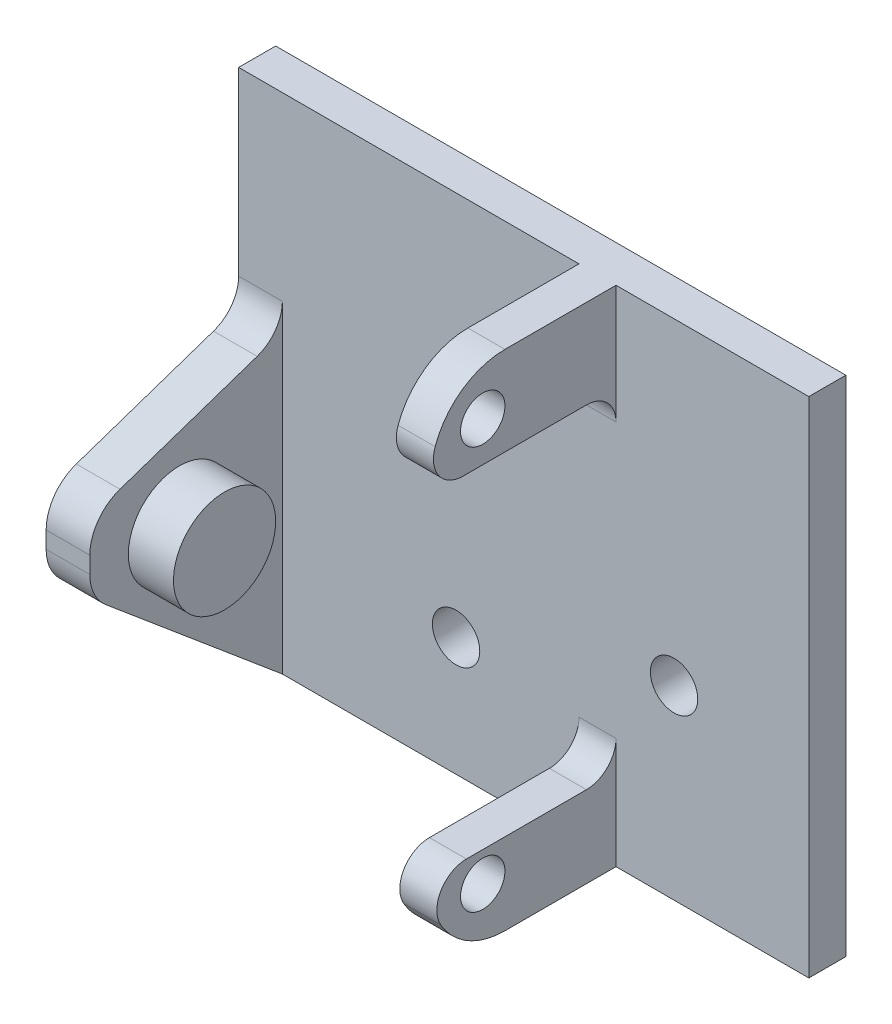
ISO-10303-21;
HEADER;
FILE_DESCRIPTION(('STEP AP214'),'2;1');
FILE_NAME('part.step','',(''),(''),'','','');
FILE_SCHEMA(('AUTOMOTIVE_DESIGN { 1 0 10303 214 1 1 1 1 }'));
ENDSEC;
DATA;
#1=APPLICATION_CONTEXT('core data for automotive mechanical design processes');
#2=APPLICATION_PROTOCOL_DEFINITION('international standard','automotive_design',2000,#1);
#3=PRODUCT_CONTEXT('',#1,'mechanical');
#4=PRODUCT('Part','Part','',(#3));
#5=PRODUCT_RELATED_PRODUCT_CATEGORY('part','',(#4));
#6=PRODUCT_DEFINITION_FORMATION('','',#4);
#7=PRODUCT_DEFINITION_CONTEXT('part definition',#1,'design');
#8=PRODUCT_DEFINITION('design','',#6,#7);
#9=PRODUCT_DEFINITION_SHAPE('','',#8);
#10=(LENGTH_UNIT() NAMED_UNIT(*) SI_UNIT(.MILLI.,.METRE.));
#11=(NAMED_UNIT(*) PLANE_ANGLE_UNIT() SI_UNIT($,.RADIAN.));
#12=(NAMED_UNIT(*) SI_UNIT($,.STERADIAN.) SOLID_ANGLE_UNIT());
#13=UNCERTAINTY_MEASURE_WITH_UNIT(LENGTH_MEASURE(1.E-05),#10,'distance_accuracy_value','');
#14=(GEOMETRIC_REPRESENTATION_CONTEXT(3) GLOBAL_UNCERTAINTY_ASSIGNED_CONTEXT((#13)) GLOBAL_UNIT_ASSIGNED_CONTEXT((#10,
#11,#12)) REPRESENTATION_CONTEXT('',''));
#15=CARTESIAN_POINT('',(0.,0.,0.));
#16=DIRECTION('',(0.,0.,1.));
#17=DIRECTION('',(1.,0.,0.));
#18=AXIS2_PLACEMENT_3D('',#15,#16,#17);
#19=CARTESIAN_POINT('',(-22.6450142317514,6.71013779527559,2.5));
#20=DIRECTION('',(1.,0.,0.));
#21=DIRECTION('',(0.,1.,0.));
#22=AXIS2_PLACEMENT_3D('',#19,#20,#21);
#23=PLANE('',#22);
#24=DIRECTION('',(0.,0.64331211729061,0.765604022812755));
#25=VECTOR('',#24,1.);
#26=CARTESIAN_POINT('',(-22.6450142317514,-17.2272454875677,14.4754931262982));
#27=LINE('',#26,#25);
#28=CARTESIAN_POINT('',(-22.6450142317514,-27.2898622047244,2.49999999999998));
#29=VERTEX_POINT('',#28);
#30=CARTESIAN_POINT('',(-22.6450142317514,-17.2655253608963,14.4299363518718));
#31=VERTEX_POINT('',#30);
#32=EDGE_CURVE('E209',#29,#31,#27,.T.);
#33=ORIENTED_EDGE('',*,*,#32,.T.);
#34=CARTESIAN_POINT('',(-22.6450142317514,-14.9687132924581,12.5));
#35=DIRECTION('',(1.,0.,0.));
#36=DIRECTION('',(0.,1.,0.));
#37=AXIS2_PLACEMENT_3D('',#34,#35,#36);
#38=CIRCLE('',#37,3.);
#39=CARTESIAN_POINT('',(-22.6450142317514,-14.9687132924581,15.5));
#40=VERTEX_POINT('',#39);
#41=EDGE_CURVE('E257',#31,#40,#38,.F.);
#42=ORIENTED_EDGE('',*,*,#41,.T.);
#43=DIRECTION('',(0.,-1.,0.));
#44=VECTOR('',#43,1.);
#45=CARTESIAN_POINT('',(-22.6450142317514,-7.28986220472441,15.5));
#46=LINE('',#45,#44);
#47=CARTESIAN_POINT('',(-22.6450142317514,-13.84136194244,15.5));
#48=VERTEX_POINT('',#47);
#49=EDGE_CURVE('E486',#48,#40,#46,.T.);
#50=ORIENTED_EDGE('',*,*,#49,.F.);
#51=CARTESIAN_POINT('',(-22.6450142317514,-13.84136194244,12.5));
#52=DIRECTION('',(1.,0.,0.));
#53=DIRECTION('',(0.,1.,0.));
#54=AXIS2_PLACEMENT_3D('',#51,#52,#53);
#55=CIRCLE('',#54,3.);
#56=CARTESIAN_POINT('',(-22.6450142317514,-10.9996910491199,13.4617206112261));
#57=VERTEX_POINT('',#56);
#58=EDGE_CURVE('E255',#48,#57,#55,.F.);
#59=ORIENTED_EDGE('',*,*,#58,.T.);
#60=DIRECTION('',(0.,0.320573537075366,-0.947223631106714));
#61=VECTOR('',#60,1.);
#62=CARTESIAN_POINT('',(-22.6450142317514,-5.78156499843623,-1.95668338554259));
#63=LINE('',#62,#61);
#64=CARTESIAN_POINT('',(-22.6450142317514,-7.86471627626999,4.19856615731159));
#65=VERTEX_POINT('',#64);
#66=EDGE_CURVE('E231',#57,#65,#63,.T.);
#67=ORIENTED_EDGE('',*,*,#66,.T.);
#68=CARTESIAN_POINT('',(-22.6450142317514,-5.49665719850321,5.));
#69=DIRECTION('',(1.,0.,0.));
#70=DIRECTION('',(0.,1.,0.));
#71=AXIS2_PLACEMENT_3D('',#68,#69,#70);
#72=CIRCLE('',#71,2.5);
#73=CARTESIAN_POINT('',(-22.6450142317514,-5.49665719850321,2.5));
#74=VERTEX_POINT('',#73);
#75=EDGE_CURVE('E267',#65,#74,#72,.T.);
#76=ORIENTED_EDGE('',*,*,#75,.T.);
#77=DIRECTION('',(0.,-1.,0.));
#78=VECTOR('',#77,1.);
#79=CARTESIAN_POINT('',(-22.6450142317514,6.71013779527559,2.5));
#80=LINE('',#79,#78);
#81=CARTESIAN_POINT('',(-22.6450142317514,6.71013779527559,2.5));
#82=VERTEX_POINT('',#81);
#83=EDGE_CURVE('E344',#82,#74,#80,.T.);
#84=ORIENTED_EDGE('',*,*,#83,.F.);
#85=DIRECTION('',(0.,0.,-1.));
#86=VECTOR('',#85,1.);
#87=CARTESIAN_POINT('',(-22.6450142317514,6.71013779527559,2.5));
#88=LINE('',#87,#86);
#89=CARTESIAN_POINT('',(-22.6450142317514,6.71013779527559,0.));
#90=VERTEX_POINT('',#89);
#91=EDGE_CURVE('E356',#82,#90,#88,.T.);
#92=ORIENTED_EDGE('',*,*,#91,.T.);
#93=DIRECTION('',(0.,-1.,0.));
#94=VECTOR('',#93,1.);
#95=CARTESIAN_POINT('',(-22.6450142317514,6.71013779527559,0.));
#96=LINE('',#95,#94);
#97=CARTESIAN_POINT('',(-22.6450142317514,-27.2898622047244,0.));
#98=VERTEX_POINT('',#97);
#99=EDGE_CURVE('E236',#90,#98,#96,.T.);
#100=ORIENTED_EDGE('',*,*,#99,.T.);
#101=DIRECTION('',(0.,0.,-1.));
#102=VECTOR('',#101,1.);
#103=CARTESIAN_POINT('',(-22.6450142317514,-27.2898622047244,2.5));
#104=LINE('',#103,#102);
#105=EDGE_CURVE('E226',#29,#98,#104,.T.);
#106=ORIENTED_EDGE('',*,*,#105,.F.);
#107=EDGE_LOOP('',(#33,#42,#50,#59,#67,#76,#84,#92,#100,#106));
#108=FACE_BOUND('',#107,.T.);
#109=ADVANCED_FACE('F60',(#108),#23,.F.);
#110=CARTESIAN_POINT('',(-22.6450142317514,-27.2898622047244,2.5));
#111=DIRECTION('',(0.,1.,0.));
#112=DIRECTION('',(0.,0.,1.));
#113=AXIS2_PLACEMENT_3D('',#110,#111,#112);
#114=PLANE('',#113);
#115=DIRECTION('',(0.,0.,-1.));
#116=VECTOR('',#115,1.);
#117=CARTESIAN_POINT('',(2.83498576824857,-27.2898622047244,15.));
#118=LINE('',#117,#116);
#119=CARTESIAN_POINT('',(2.83498576824857,-27.2898622047244,10.));
#120=VERTEX_POINT('',#119);
#121=CARTESIAN_POINT('',(2.83498576824857,-27.2898622047244,2.5));
#122=VERTEX_POINT('',#121);
#123=EDGE_CURVE('E342',#120,#122,#118,.T.);
#124=ORIENTED_EDGE('',*,*,#123,.F.);
#125=DIRECTION('',(1.,0.,0.));
#126=VECTOR('',#125,1.);
#127=CARTESIAN_POINT('',(-22.6450142317514,-27.2898622047244,10.));
#128=LINE('',#127,#126);
#129=CARTESIAN_POINT('',(0.334985768248565,-27.2898622047244,10.));
#130=VERTEX_POINT('',#129);
#131=EDGE_CURVE('E297',#120,#130,#128,.F.);
#132=ORIENTED_EDGE('',*,*,#131,.T.);
#133=DIRECTION('',(0.,0.,-1.));
#134=VECTOR('',#133,1.);
#135=CARTESIAN_POINT('',(0.334985768248565,-27.2898622047244,15.));
#136=LINE('',#135,#134);
#137=CARTESIAN_POINT('',(0.334985768248565,-27.2898622047244,2.5));
#138=VERTEX_POINT('',#137);
#139=EDGE_CURVE('E331',#130,#138,#136,.T.);
#140=ORIENTED_EDGE('',*,*,#139,.T.);
#141=DIRECTION('',(1.,0.,0.));
#142=VECTOR('',#141,1.);
#143=CARTESIAN_POINT('',(-22.6450142317514,-27.2898622047244,2.5));
#144=LINE('',#143,#142);
#145=CARTESIAN_POINT('',(-19.6950142317514,-27.2898622047244,2.49999999999998));
#146=VERTEX_POINT('',#145);
#147=EDGE_CURVE('E229',#146,#138,#144,.T.);
#148=ORIENTED_EDGE('',*,*,#147,.F.);
#149=DIRECTION('',(-1.,0.,0.));
#150=VECTOR('',#149,1.);
#151=CARTESIAN_POINT('',(-7.64501423175144,-27.2898622047244,2.49999999999998));
#152=LINE('',#151,#150);
#153=EDGE_CURVE('E213',#146,#29,#152,.T.);
#154=ORIENTED_EDGE('',*,*,#153,.T.);
#155=ORIENTED_EDGE('',*,*,#105,.T.);
#156=DIRECTION('',(1.,0.,0.));
#157=VECTOR('',#156,1.);
#158=CARTESIAN_POINT('',(-22.6450142317514,-27.2898622047244,0.));
#159=LINE('',#158,#157);
#160=CARTESIAN_POINT('',(15.8549857682486,-27.2898622047244,0.));
#161=VERTEX_POINT('',#160);
#162=EDGE_CURVE('E358',#98,#161,#159,.T.);
#163=ORIENTED_EDGE('',*,*,#162,.T.);
#164=DIRECTION('',(0.,0.,-1.));
#165=VECTOR('',#164,1.);
#166=CARTESIAN_POINT('',(15.8549857682486,-27.2898622047244,2.5));
#167=LINE('',#166,#165);
#168=CARTESIAN_POINT('',(15.8549857682486,-27.2898622047244,2.5));
#169=VERTEX_POINT('',#168);
#170=EDGE_CURVE('E238',#169,#161,#167,.T.);
#171=ORIENTED_EDGE('',*,*,#170,.F.);
#172=EDGE_CURVE('E347',#122,#169,#144,.T.);
#173=ORIENTED_EDGE('',*,*,#172,.F.);
#174=EDGE_LOOP('',(#124,#132,#140,#148,#154,#155,#163,#171,#173));
#175=FACE_BOUND('',#174,.T.);
#176=ADVANCED_FACE('F225',(#175),#114,.F.);
#177=CARTESIAN_POINT('',(-19.6950142317514,-27.2898622047244,15.5));
#178=DIRECTION('',(-1.,0.,0.));
#179=DIRECTION('',(0.,0.,1.));
#180=AXIS2_PLACEMENT_3D('',#177,#178,#179);
#181=PLANE('',#180);
#182=CARTESIAN_POINT('',(-19.6950142317514,-15.0898622047244,9.45));
#183=DIRECTION('',(-1.,0.,0.));
#184=DIRECTION('',(0.,0.,1.));
#185=AXIS2_PLACEMENT_3D('',#182,#183,#184);
#186=CIRCLE('',#185,3.45);
#187=CARTESIAN_POINT('',(-19.6950142317514,-15.0898622047244,12.9));
#188=VERTEX_POINT('',#187);
#189=EDGE_CURVE('E220',#188,#188,#186,.T.);
#190=ORIENTED_EDGE('',*,*,#189,.T.);
#191=EDGE_LOOP('',(#190));
#192=FACE_BOUND('',#191,.T.);
#193=DIRECTION('',(0.,1.,0.));
#194=VECTOR('',#193,1.);
#195=CARTESIAN_POINT('',(-19.6950142317514,-27.2898622047244,15.5));
#196=LINE('',#195,#194);
#197=CARTESIAN_POINT('',(-19.6950142317514,-14.9687132924581,15.5));
#198=VERTEX_POINT('',#197);
#199=CARTESIAN_POINT('',(-19.6950142317514,-13.84136194244,15.5));
#200=VERTEX_POINT('',#199);
#201=EDGE_CURVE('E483',#198,#200,#196,.T.);
#202=ORIENTED_EDGE('',*,*,#201,.F.);
#203=CARTESIAN_POINT('',(-19.6950142317514,-14.9687132924581,12.5));
#204=DIRECTION('',(-1.,0.,0.));
#205=DIRECTION('',(0.,0.,1.));
#206=AXIS2_PLACEMENT_3D('',#203,#204,#205);
#207=CIRCLE('',#206,3.);
#208=CARTESIAN_POINT('',(-19.6950142317514,-17.2655253608963,14.4299363518718));
#209=VERTEX_POINT('',#208);
#210=EDGE_CURVE('E252',#198,#209,#207,.F.);
#211=ORIENTED_EDGE('',*,*,#210,.T.);
#212=DIRECTION('',(0.,0.64331211729061,0.765604022812755));
#213=VECTOR('',#212,1.);
#214=CARTESIAN_POINT('',(-19.6950142317514,-20.88707172074,10.1199437567119));
#215=LINE('',#214,#213);
#216=EDGE_CURVE('E478',#146,#209,#215,.T.);
#217=ORIENTED_EDGE('',*,*,#216,.F.);
#218=DIRECTION('',(0.,1.,0.));
#219=VECTOR('',#218,1.);
#220=CARTESIAN_POINT('',(-19.6950142317514,-27.2898622047244,2.5));
#221=LINE('',#220,#219);
#222=CARTESIAN_POINT('',(-19.6950142317514,-5.49665719850321,2.5));
#223=VERTEX_POINT('',#222);
#224=EDGE_CURVE('E473',#146,#223,#221,.T.);
#225=ORIENTED_EDGE('',*,*,#224,.T.);
#226=CARTESIAN_POINT('',(-19.6950142317514,-5.49665719850321,5.));
#227=DIRECTION('',(-1.,0.,0.));
#228=DIRECTION('',(0.,0.,1.));
#229=AXIS2_PLACEMENT_3D('',#226,#227,#228);
#230=CIRCLE('',#229,2.5);
#231=CARTESIAN_POINT('',(-19.6950142317514,-7.86471627626999,4.19856615731158));
#232=VERTEX_POINT('',#231);
#233=EDGE_CURVE('E269',#223,#232,#230,.T.);
#234=ORIENTED_EDGE('',*,*,#233,.T.);
#235=DIRECTION('',(0.,0.320573537075366,-0.947223631106715));
#236=VECTOR('',#235,1.);
#237=CARTESIAN_POINT('',(-19.6950142317514,-13.2927228459129,20.2371204917559));
#238=LINE('',#237,#236);
#239=CARTESIAN_POINT('',(-19.6950142317514,-10.9996910491199,13.4617206112261));
#240=VERTEX_POINT('',#239);
#241=EDGE_CURVE('E471',#240,#232,#238,.T.);
#242=ORIENTED_EDGE('',*,*,#241,.F.);
#243=CARTESIAN_POINT('',(-19.6950142317514,-13.84136194244,12.5));
#244=DIRECTION('',(-1.,0.,0.));
#245=DIRECTION('',(0.,0.,1.));
#246=AXIS2_PLACEMENT_3D('',#243,#244,#245);
#247=CIRCLE('',#246,3.);
#248=EDGE_CURVE('E250',#240,#200,#247,.F.);
#249=ORIENTED_EDGE('',*,*,#248,.T.);
#250=EDGE_LOOP('',(#202,#211,#217,#225,#234,#242,#249));
#251=FACE_BOUND('',#250,.T.);
#252=ADVANCED_FACE('F396',(#192,#251),#181,.F.);
#253=CARTESIAN_POINT('',(0.,0.,15.5));
#254=DIRECTION('',(0.,0.,1.));
#255=DIRECTION('',(1.,0.,0.));
#256=AXIS2_PLACEMENT_3D('',#253,#254,#255);
#257=PLANE('',#256);
#258=ORIENTED_EDGE('',*,*,#49,.T.);
#259=DIRECTION('',(1.,0.,0.));
#260=VECTOR('',#259,1.);
#261=CARTESIAN_POINT('',(0.,-14.9687132924581,15.5));
#262=LINE('',#261,#260);
#263=EDGE_CURVE('E241',#40,#198,#262,.T.);
#264=ORIENTED_EDGE('',*,*,#263,.T.);
#265=ORIENTED_EDGE('',*,*,#201,.T.);
#266=DIRECTION('',(-1.,0.,0.));
#267=VECTOR('',#266,1.);
#268=CARTESIAN_POINT('',(0.,-13.84136194244,15.5));
#269=LINE('',#268,#267);
#270=EDGE_CURVE('E237',#200,#48,#269,.T.);
#271=ORIENTED_EDGE('',*,*,#270,.T.);
#272=EDGE_LOOP('',(#258,#264,#265,#271));
#273=FACE_BOUND('',#272,.T.);
#274=ADVANCED_FACE('F522',(#273),#257,.T.);
#275=CARTESIAN_POINT('',(0.,0.,2.5));
#276=DIRECTION('',(0.,0.,1.));
#277=DIRECTION('',(1.,0.,0.));
#278=AXIS2_PLACEMENT_3D('',#275,#276,#277);
#279=PLANE('',#278);
#280=CARTESIAN_POINT('',(-7.96501423175144,-19.2898622047244,2.5));
#281=DIRECTION('',(0.,0.,1.));
#282=DIRECTION('',(1.,0.,0.));
#283=AXIS2_PLACEMENT_3D('',#280,#281,#282);
#284=CIRCLE('',#283,1.6);
#285=CARTESIAN_POINT('',(-6.36501423175144,-19.2898622047244,2.5));
#286=VERTEX_POINT('',#285);
#287=EDGE_CURVE('E752',#286,#286,#284,.T.);
#288=ORIENTED_EDGE('',*,*,#287,.F.);
#289=EDGE_LOOP('',(#288));
#290=FACE_BOUND('',#289,.T.);
#291=CARTESIAN_POINT('',(6.75498576824856,-14.7398622047244,2.5));
#292=DIRECTION('',(0.,0.,1.));
#293=DIRECTION('',(1.,0.,0.));
#294=AXIS2_PLACEMENT_3D('',#291,#292,#293);
#295=CIRCLE('',#294,1.6);
#296=CARTESIAN_POINT('',(8.35498576824856,-14.7398622047244,2.5));
#297=VERTEX_POINT('',#296);
#298=EDGE_CURVE('E757',#297,#297,#295,.T.);
#299=ORIENTED_EDGE('',*,*,#298,.F.);
#300=EDGE_LOOP('',(#299));
#301=FACE_BOUND('',#300,.T.);
#302=DIRECTION('',(0.,-1.,0.));
#303=VECTOR('',#302,1.);
#304=CARTESIAN_POINT('',(0.334985768248565,-27.2898622047244,2.5));
#305=LINE('',#304,#303);
#306=CARTESIAN_POINT('',(0.334985768248567,-19.7898622047244,2.5));
#307=VERTEX_POINT('',#306);
#308=EDGE_CURVE('E332',#307,#138,#305,.T.);
#309=ORIENTED_EDGE('',*,*,#308,.F.);
#310=DIRECTION('',(-1.,0.,0.));
#311=VECTOR('',#310,1.);
#312=CARTESIAN_POINT('',(0.,-19.7898622047244,2.5));
#313=LINE('',#312,#311);
#314=CARTESIAN_POINT('',(2.83498576824856,-19.7898622047244,2.5));
#315=VERTEX_POINT('',#314);
#316=EDGE_CURVE('E277',#307,#315,#313,.F.);
#317=ORIENTED_EDGE('',*,*,#316,.T.);
#318=DIRECTION('',(0.,1.,0.));
#319=VECTOR('',#318,1.);
#320=CARTESIAN_POINT('',(2.83498576824857,-21.7898622047244,2.5));
#321=LINE('',#320,#319);
#322=EDGE_CURVE('E337',#122,#315,#321,.T.);
#323=ORIENTED_EDGE('',*,*,#322,.F.);
#324=ORIENTED_EDGE('',*,*,#172,.T.);
#325=DIRECTION('',(0.,1.,0.));
#326=VECTOR('',#325,1.);
#327=CARTESIAN_POINT('',(15.8549857682486,6.71013779527559,2.5));
#328=LINE('',#327,#326);
#329=CARTESIAN_POINT('',(15.8549857682486,6.71013779527559,2.5));
#330=VERTEX_POINT('',#329);
#331=EDGE_CURVE('E350',#169,#330,#328,.T.);
#332=ORIENTED_EDGE('',*,*,#331,.T.);
#333=DIRECTION('',(-1.,0.,0.));
#334=VECTOR('',#333,1.);
#335=CARTESIAN_POINT('',(-22.6450142317514,6.71013779527559,2.5));
#336=LINE('',#335,#334);
#337=CARTESIAN_POINT('',(2.83498576824856,6.71013779527559,2.5));
#338=VERTEX_POINT('',#337);
#339=EDGE_CURVE('E353',#330,#338,#336,.T.);
#340=ORIENTED_EDGE('',*,*,#339,.T.);
#341=DIRECTION('',(0.,1.,0.));
#342=VECTOR('',#341,1.);
#343=CARTESIAN_POINT('',(2.83498576824856,6.71013779527559,2.5));
#344=LINE('',#343,#342);
#345=CARTESIAN_POINT('',(2.83498576824856,-1.28986220472441,2.5));
#346=VERTEX_POINT('',#345);
#347=EDGE_CURVE('E450',#346,#338,#344,.T.);
#348=ORIENTED_EDGE('',*,*,#347,.F.);
#349=DIRECTION('',(1.,0.,0.));
#350=VECTOR('',#349,1.);
#351=CARTESIAN_POINT('',(0.,-1.28986220472441,2.5));
#352=LINE('',#351,#350);
#353=CARTESIAN_POINT('',(0.334985768248563,-1.28986220472441,2.5));
#354=VERTEX_POINT('',#353);
#355=EDGE_CURVE('E274',#346,#354,#352,.F.);
#356=ORIENTED_EDGE('',*,*,#355,.T.);
#357=DIRECTION('',(0.,-1.,0.));
#358=VECTOR('',#357,1.);
#359=CARTESIAN_POINT('',(0.334985768248563,6.71013779527559,2.5));
#360=LINE('',#359,#358);
#361=CARTESIAN_POINT('',(0.334985768248563,6.71013779527559,2.5));
#362=VERTEX_POINT('',#361);
#363=EDGE_CURVE('E456',#362,#354,#360,.T.);
#364=ORIENTED_EDGE('',*,*,#363,.F.);
#365=EDGE_CURVE('E352',#362,#82,#336,.T.);
#366=ORIENTED_EDGE('',*,*,#365,.T.);
#367=ORIENTED_EDGE('',*,*,#83,.T.);
#368=DIRECTION('',(-1.,0.,0.));
#369=VECTOR('',#368,1.);
#370=CARTESIAN_POINT('',(-19.6950142317514,-5.49665719850321,2.5));
#371=LINE('',#370,#369);
#372=EDGE_CURVE('E264',#74,#223,#371,.F.);
#373=ORIENTED_EDGE('',*,*,#372,.T.);
#374=ORIENTED_EDGE('',*,*,#224,.F.);
#375=ORIENTED_EDGE('',*,*,#147,.T.);
#376=EDGE_LOOP('',(#309,#317,#323,#324,#332,#340,#348,#356,#364,#366,#367,#373,#374,#375));
#377=FACE_BOUND('',#376,.T.);
#378=ADVANCED_FACE('F380',(#290,#301,#377),#279,.T.);
#379=CARTESIAN_POINT('',(15.8549857682486,6.71013779527559,2.5));
#380=DIRECTION('',(-1.,0.,0.));
#381=DIRECTION('',(0.,-1.,0.));
#382=AXIS2_PLACEMENT_3D('',#379,#380,#381);
#383=PLANE('',#382);
#384=DIRECTION('',(0.,1.,0.));
#385=VECTOR('',#384,1.);
#386=CARTESIAN_POINT('',(15.8549857682486,6.71013779527559,0.));
#387=LINE('',#386,#385);
#388=CARTESIAN_POINT('',(15.8549857682486,6.71013779527559,0.));
#389=VERTEX_POINT('',#388);
#390=EDGE_CURVE('E360',#161,#389,#387,.T.);
#391=ORIENTED_EDGE('',*,*,#390,.T.);
#392=DIRECTION('',(0.,0.,-1.));
#393=VECTOR('',#392,1.);
#394=CARTESIAN_POINT('',(15.8549857682486,6.71013779527559,2.5));
#395=LINE('',#394,#393);
#396=EDGE_CURVE('E244',#330,#389,#395,.T.);
#397=ORIENTED_EDGE('',*,*,#396,.F.);
#398=ORIENTED_EDGE('',*,*,#331,.F.);
#399=ORIENTED_EDGE('',*,*,#170,.T.);
#400=EDGE_LOOP('',(#391,#397,#398,#399));
#401=FACE_BOUND('',#400,.T.);
#402=ADVANCED_FACE('F378',(#401),#383,.F.);
#403=CARTESIAN_POINT('',(-22.6450142317514,6.71013779527559,2.5));
#404=DIRECTION('',(0.,-1.,0.));
#405=DIRECTION('',(0.,0.,-1.));
#406=AXIS2_PLACEMENT_3D('',#403,#404,#405);
#407=PLANE('',#406);
#408=DIRECTION('',(0.,0.,-1.));
#409=VECTOR('',#408,1.);
#410=CARTESIAN_POINT('',(0.334985768248563,6.71013779527559,15.));
#411=LINE('',#410,#409);
#412=CARTESIAN_POINT('',(0.334985768248563,6.71013779527559,10.));
#413=VERTEX_POINT('',#412);
#414=EDGE_CURVE('E448',#413,#362,#411,.T.);
#415=ORIENTED_EDGE('',*,*,#414,.F.);
#416=DIRECTION('',(-1.,0.,0.));
#417=VECTOR('',#416,1.);
#418=CARTESIAN_POINT('',(-22.6450142317514,6.71013779527559,10.));
#419=LINE('',#418,#417);
#420=CARTESIAN_POINT('',(2.83498576824856,6.71013779527559,10.));
#421=VERTEX_POINT('',#420);
#422=EDGE_CURVE('E303',#413,#421,#419,.F.);
#423=ORIENTED_EDGE('',*,*,#422,.T.);
#424=DIRECTION('',(0.,0.,-1.));
#425=VECTOR('',#424,1.);
#426=CARTESIAN_POINT('',(2.83498576824856,6.71013779527559,15.));
#427=LINE('',#426,#425);
#428=EDGE_CURVE('E446',#421,#338,#427,.T.);
#429=ORIENTED_EDGE('',*,*,#428,.T.);
#430=ORIENTED_EDGE('',*,*,#339,.F.);
#431=ORIENTED_EDGE('',*,*,#396,.T.);
#432=DIRECTION('',(-1.,0.,0.));
#433=VECTOR('',#432,1.);
#434=CARTESIAN_POINT('',(-22.6450142317514,6.71013779527559,0.));
#435=LINE('',#434,#433);
#436=EDGE_CURVE('E348',#389,#90,#435,.T.);
#437=ORIENTED_EDGE('',*,*,#436,.T.);
#438=ORIENTED_EDGE('',*,*,#91,.F.);
#439=ORIENTED_EDGE('',*,*,#365,.F.);
#440=EDGE_LOOP('',(#415,#423,#429,#430,#431,#437,#438,#439));
#441=FACE_BOUND('',#440,.T.);
#442=ADVANCED_FACE('F369',(#441),#407,.F.);
#443=CARTESIAN_POINT('',(0.,0.,0.));
#444=DIRECTION('',(0.,0.,1.));
#445=DIRECTION('',(1.,0.,0.));
#446=AXIS2_PLACEMENT_3D('',#443,#444,#445);
#447=PLANE('',#446);
#448=CARTESIAN_POINT('',(-7.96501423175144,-19.2898622047244,0.));
#449=DIRECTION('',(0.,0.,-1.));
#450=DIRECTION('',(-1.,0.,0.));
#451=AXIS2_PLACEMENT_3D('',#448,#449,#450);
#452=CIRCLE('',#451,1.6);
#453=CARTESIAN_POINT('',(-9.56501423175144,-19.2898622047244,0.));
#454=VERTEX_POINT('',#453);
#455=EDGE_CURVE('E760',#454,#454,#452,.T.);
#456=ORIENTED_EDGE('',*,*,#455,.F.);
#457=EDGE_LOOP('',(#456));
#458=FACE_BOUND('',#457,.T.);
#459=CARTESIAN_POINT('',(6.75498576824856,-14.7398622047244,0.));
#460=DIRECTION('',(0.,0.,-1.));
#461=DIRECTION('',(-1.,0.,0.));
#462=AXIS2_PLACEMENT_3D('',#459,#460,#461);
#463=CIRCLE('',#462,1.6);
#464=CARTESIAN_POINT('',(5.15498576824856,-14.7398622047244,0.));
#465=VERTEX_POINT('',#464);
#466=EDGE_CURVE('E761',#465,#465,#463,.T.);
#467=ORIENTED_EDGE('',*,*,#466,.F.);
#468=EDGE_LOOP('',(#467));
#469=FACE_BOUND('',#468,.T.);
#470=ORIENTED_EDGE('',*,*,#99,.F.);
#471=ORIENTED_EDGE('',*,*,#436,.F.);
#472=ORIENTED_EDGE('',*,*,#390,.F.);
#473=ORIENTED_EDGE('',*,*,#162,.F.);
#474=EDGE_LOOP('',(#470,#471,#472,#473));
#475=FACE_BOUND('',#474,.T.);
#476=ADVANCED_FACE('F375',(#458,#469,#475),#447,.F.);
#477=CARTESIAN_POINT('',(2.83498576824857,-21.7898622047244,15.));
#478=DIRECTION('',(-1.,0.,0.));
#479=DIRECTION('',(0.,-1.,0.));
#480=AXIS2_PLACEMENT_3D('',#477,#478,#479);
#481=PLANE('',#480);
#482=CARTESIAN_POINT('',(2.83498576824856,-23.7898622047244,11.5));
#483=DIRECTION('',(1.,0.,0.));
#484=DIRECTION('',(0.,1.,0.));
#485=AXIS2_PLACEMENT_3D('',#482,#483,#484);
#486=CIRCLE('',#485,1.5);
#487=CARTESIAN_POINT('',(2.83498576824856,-22.2898622047244,11.5));
#488=VERTEX_POINT('',#487);
#489=EDGE_CURVE('E489',#488,#488,#486,.T.);
#490=ORIENTED_EDGE('',*,*,#489,.F.);
#491=EDGE_LOOP('',(#490));
#492=FACE_BOUND('',#491,.T.);
#493=DIRECTION('',(0.,0.,-1.));
#494=VECTOR('',#493,1.);
#495=CARTESIAN_POINT('',(2.83498576824857,-21.7898622047244,15.));
#496=LINE('',#495,#494);
#497=CARTESIAN_POINT('',(2.83498576824857,-21.7898622047244,12.5980762113533));
#498=VERTEX_POINT('',#497);
#499=CARTESIAN_POINT('',(2.83498576824857,-21.7898622047244,4.5));
#500=VERTEX_POINT('',#499);
#501=EDGE_CURVE('E335',#498,#500,#496,.T.);
#502=ORIENTED_EDGE('',*,*,#501,.F.);
#503=CARTESIAN_POINT('',(2.83498576824857,-23.7898622047244,12.5980762113533));
#504=DIRECTION('',(-1.,0.,0.));
#505=DIRECTION('',(0.,-1.,0.));
#506=AXIS2_PLACEMENT_3D('',#503,#504,#505);
#507=CIRCLE('',#506,2.);
#508=CARTESIAN_POINT('',(2.83498576824857,-24.7898622047244,14.3301270189222));
#509=VERTEX_POINT('',#508);
#510=EDGE_CURVE('E12',#498,#509,#507,.F.);
#511=ORIENTED_EDGE('',*,*,#510,.T.);
#512=CARTESIAN_POINT('',(2.83498576824857,-22.2898622047244,10.));
#513=DIRECTION('',(-1.,0.,0.));
#514=DIRECTION('',(0.,-1.,0.));
#515=AXIS2_PLACEMENT_3D('',#512,#513,#514);
#516=CIRCLE('',#515,5.);
#517=EDGE_CURVE('E295',#509,#120,#516,.F.);
#518=ORIENTED_EDGE('',*,*,#517,.T.);
#519=ORIENTED_EDGE('',*,*,#123,.T.);
#520=ORIENTED_EDGE('',*,*,#322,.T.);
#521=CARTESIAN_POINT('',(2.83498576824856,-19.7898622047244,4.5));
#522=DIRECTION('',(-1.,0.,0.));
#523=DIRECTION('',(0.,-1.,0.));
#524=AXIS2_PLACEMENT_3D('',#521,#522,#523);
#525=CIRCLE('',#524,2.);
#526=EDGE_CURVE('E286',#315,#500,#525,.T.);
#527=ORIENTED_EDGE('',*,*,#526,.T.);
#528=EDGE_LOOP('',(#502,#511,#518,#519,#520,#527));
#529=FACE_BOUND('',#528,.T.);
#530=ADVANCED_FACE('F383',(#492,#529),#481,.F.);
#531=CARTESIAN_POINT('',(0.334985768248567,-21.7898622047244,15.));
#532=DIRECTION('',(0.,-1.,0.));
#533=DIRECTION('',(0.,0.,-1.));
#534=AXIS2_PLACEMENT_3D('',#531,#532,#533);
#535=PLANE('',#534);
#536=DIRECTION('',(0.,0.,-1.));
#537=VECTOR('',#536,1.);
#538=CARTESIAN_POINT('',(0.334985768248567,-21.7898622047244,15.));
#539=LINE('',#538,#537);
#540=CARTESIAN_POINT('',(0.334985768248567,-21.7898622047244,12.5980762113533));
#541=VERTEX_POINT('',#540);
#542=CARTESIAN_POINT('',(0.334985768248567,-21.7898622047244,4.5));
#543=VERTEX_POINT('',#542);
#544=EDGE_CURVE('E333',#541,#543,#539,.T.);
#545=ORIENTED_EDGE('',*,*,#544,.F.);
#546=DIRECTION('',(-1.,0.,0.));
#547=VECTOR('',#546,1.);
#548=CARTESIAN_POINT('',(2.83498576824857,-21.7898622047244,12.5980762113533));
#549=LINE('',#548,#547);
#550=EDGE_CURVE('E68',#541,#498,#549,.F.);
#551=ORIENTED_EDGE('',*,*,#550,.T.);
#552=ORIENTED_EDGE('',*,*,#501,.T.);
#553=DIRECTION('',(-1.,0.,0.));
#554=VECTOR('',#553,1.);
#555=CARTESIAN_POINT('',(0.334985768248567,-21.7898622047244,4.5));
#556=LINE('',#555,#554);
#557=EDGE_CURVE('E271',#500,#543,#556,.T.);
#558=ORIENTED_EDGE('',*,*,#557,.T.);
#559=EDGE_LOOP('',(#545,#551,#552,#558));
#560=FACE_BOUND('',#559,.T.);
#561=ADVANCED_FACE('F506',(#560),#535,.F.);
#562=CARTESIAN_POINT('',(0.334985768248565,-27.2898622047244,15.));
#563=DIRECTION('',(1.,0.,0.));
#564=DIRECTION('',(0.,1.,0.));
#565=AXIS2_PLACEMENT_3D('',#562,#563,#564);
#566=PLANE('',#565);
#567=CARTESIAN_POINT('',(0.334985768248565,-23.7898622047244,11.5));
#568=DIRECTION('',(1.,0.,0.));
#569=DIRECTION('',(0.,1.,0.));
#570=AXIS2_PLACEMENT_3D('',#567,#568,#569);
#571=CIRCLE('',#570,1.5);
#572=CARTESIAN_POINT('',(0.334985768248565,-22.2898622047244,11.5));
#573=VERTEX_POINT('',#572);
#574=EDGE_CURVE('E494',#573,#573,#571,.F.);
#575=ORIENTED_EDGE('',*,*,#574,.F.);
#576=EDGE_LOOP('',(#575));
#577=FACE_BOUND('',#576,.T.);
#578=CARTESIAN_POINT('',(0.334985768248566,-22.2898622047244,10.));
#579=DIRECTION('',(1.,0.,0.));
#580=DIRECTION('',(0.,1.,0.));
#581=AXIS2_PLACEMENT_3D('',#578,#579,#580);
#582=CIRCLE('',#581,5.);
#583=CARTESIAN_POINT('',(0.334985768248566,-24.7898622047244,14.3301270189222));
#584=VERTEX_POINT('',#583);
#585=EDGE_CURVE('E299',#130,#584,#582,.F.);
#586=ORIENTED_EDGE('',*,*,#585,.T.);
#587=CARTESIAN_POINT('',(0.334985768248566,-23.7898622047244,12.5980762113533));
#588=DIRECTION('',(1.,0.,0.));
#589=DIRECTION('',(0.,1.,0.));
#590=AXIS2_PLACEMENT_3D('',#587,#588,#589);
#591=CIRCLE('',#590,2.);
#592=EDGE_CURVE('E82',#584,#541,#591,.F.);
#593=ORIENTED_EDGE('',*,*,#592,.T.);
#594=ORIENTED_EDGE('',*,*,#544,.T.);
#595=CARTESIAN_POINT('',(0.334985768248567,-19.7898622047244,4.5));
#596=DIRECTION('',(1.,0.,0.));
#597=DIRECTION('',(0.,1.,0.));
#598=AXIS2_PLACEMENT_3D('',#595,#596,#597);
#599=CIRCLE('',#598,2.);
#600=EDGE_CURVE('E283',#543,#307,#599,.T.);
#601=ORIENTED_EDGE('',*,*,#600,.T.);
#602=ORIENTED_EDGE('',*,*,#308,.T.);
#603=ORIENTED_EDGE('',*,*,#139,.F.);
#604=EDGE_LOOP('',(#586,#593,#594,#601,#602,#603));
#605=FACE_BOUND('',#604,.T.);
#606=ADVANCED_FACE('F329',(#577,#605),#566,.F.);
#607=CARTESIAN_POINT('',(0.334985768248563,6.71013779527559,15.));
#608=DIRECTION('',(1.,0.,0.));
#609=DIRECTION('',(0.,1.,0.));
#610=AXIS2_PLACEMENT_3D('',#607,#608,#609);
#611=PLANE('',#610);
#612=CARTESIAN_POINT('',(0.334985768248561,3.41013779527559,11.5));
#613=DIRECTION('',(1.,0.,0.));
#614=DIRECTION('',(0.,1.,0.));
#615=AXIS2_PLACEMENT_3D('',#612,#613,#614);
#616=CIRCLE('',#615,1.5);
#617=CARTESIAN_POINT('',(0.334985768248561,4.91013779527559,11.5));
#618=VERTEX_POINT('',#617);
#619=EDGE_CURVE('E460',#618,#618,#616,.F.);
#620=ORIENTED_EDGE('',*,*,#619,.F.);
#621=EDGE_LOOP('',(#620));
#622=FACE_BOUND('',#621,.T.);
#623=DIRECTION('',(0.,0.,-1.));
#624=VECTOR('',#623,1.);
#625=CARTESIAN_POINT('',(0.334985768248563,0.710137795275591,15.));
#626=LINE('',#625,#624);
#627=CARTESIAN_POINT('',(0.334985768248563,0.710137795275591,12.8284271247462));
#628=VERTEX_POINT('',#627);
#629=CARTESIAN_POINT('',(0.334985768248563,0.710137795275591,4.5));
#630=VERTEX_POINT('',#629);
#631=EDGE_CURVE('E445',#628,#630,#626,.T.);
#632=ORIENTED_EDGE('',*,*,#631,.F.);
#633=CARTESIAN_POINT('',(0.334985768248563,2.71013779527559,12.8284271247462));
#634=DIRECTION('',(1.,0.,0.));
#635=DIRECTION('',(0.,1.,0.));
#636=AXIS2_PLACEMENT_3D('',#633,#634,#635);
#637=CIRCLE('',#636,2.);
#638=CARTESIAN_POINT('',(0.334985768248563,3.37680446194226,14.7140452079103));
#639=VERTEX_POINT('',#638);
#640=EDGE_CURVE('E315',#628,#639,#637,.F.);
#641=ORIENTED_EDGE('',*,*,#640,.T.);
#642=CARTESIAN_POINT('',(0.334985768248563,1.71013779527559,10.));
#643=DIRECTION('',(1.,0.,0.));
#644=DIRECTION('',(0.,1.,0.));
#645=AXIS2_PLACEMENT_3D('',#642,#643,#644);
#646=CIRCLE('',#645,5.);
#647=EDGE_CURVE('E301',#639,#413,#646,.F.);
#648=ORIENTED_EDGE('',*,*,#647,.T.);
#649=ORIENTED_EDGE('',*,*,#414,.T.);
#650=ORIENTED_EDGE('',*,*,#363,.T.);
#651=CARTESIAN_POINT('',(0.334985768248563,-1.28986220472441,4.5));
#652=DIRECTION('',(1.,0.,0.));
#653=DIRECTION('',(0.,1.,0.));
#654=AXIS2_PLACEMENT_3D('',#651,#652,#653);
#655=CIRCLE('',#654,2.);
#656=EDGE_CURVE('E292',#354,#630,#655,.T.);
#657=ORIENTED_EDGE('',*,*,#656,.T.);
#658=EDGE_LOOP('',(#632,#641,#648,#649,#650,#657));
#659=FACE_BOUND('',#658,.T.);
#660=ADVANCED_FACE('F455',(#622,#659),#611,.F.);
#661=CARTESIAN_POINT('',(0.334985768248563,0.710137795275591,15.));
#662=DIRECTION('',(0.,1.,0.));
#663=DIRECTION('',(-1.,0.,0.));
#664=AXIS2_PLACEMENT_3D('',#661,#662,#663);
#665=PLANE('',#664);
#666=DIRECTION('',(0.,0.,-1.));
#667=VECTOR('',#666,1.);
#668=CARTESIAN_POINT('',(2.83498576824856,0.710137795275591,15.));
#669=LINE('',#668,#667);
#670=CARTESIAN_POINT('',(2.83498576824856,0.710137795275591,12.8284271247462));
#671=VERTEX_POINT('',#670);
#672=CARTESIAN_POINT('',(2.83498576824856,0.710137795275591,4.5));
#673=VERTEX_POINT('',#672);
#674=EDGE_CURVE('E438',#671,#673,#669,.T.);
#675=ORIENTED_EDGE('',*,*,#674,.F.);
#676=DIRECTION('',(1.,0.,0.));
#677=VECTOR('',#676,1.);
#678=CARTESIAN_POINT('',(0.334985768248563,0.710137795275592,12.8284271247462));
#679=LINE('',#678,#677);
#680=EDGE_CURVE('E313',#671,#628,#679,.F.);
#681=ORIENTED_EDGE('',*,*,#680,.T.);
#682=ORIENTED_EDGE('',*,*,#631,.T.);
#683=DIRECTION('',(1.,0.,0.));
#684=VECTOR('',#683,1.);
#685=CARTESIAN_POINT('',(0.334985768248563,0.710137795275591,4.5));
#686=LINE('',#685,#684);
#687=EDGE_CURVE('E280',#630,#673,#686,.T.);
#688=ORIENTED_EDGE('',*,*,#687,.T.);
#689=EDGE_LOOP('',(#675,#681,#682,#688));
#690=FACE_BOUND('',#689,.T.);
#691=ADVANCED_FACE('F442',(#690),#665,.F.);
#692=CARTESIAN_POINT('',(2.83498576824856,6.71013779527559,15.));
#693=DIRECTION('',(-1.,0.,0.));
#694=DIRECTION('',(0.,-1.,0.));
#695=AXIS2_PLACEMENT_3D('',#692,#693,#694);
#696=PLANE('',#695);
#697=CARTESIAN_POINT('',(2.83498576824856,3.41013779527559,11.5));
#698=DIRECTION('',(1.,0.,0.));
#699=DIRECTION('',(0.,1.,0.));
#700=AXIS2_PLACEMENT_3D('',#697,#698,#699);
#701=CIRCLE('',#700,1.5);
#702=CARTESIAN_POINT('',(2.83498576824856,4.91013779527559,11.5));
#703=VERTEX_POINT('',#702);
#704=EDGE_CURVE('E491',#703,#703,#701,.T.);
#705=ORIENTED_EDGE('',*,*,#704,.F.);
#706=EDGE_LOOP('',(#705));
#707=FACE_BOUND('',#706,.T.);
#708=CARTESIAN_POINT('',(2.83498576824856,1.71013779527559,10.));
#709=DIRECTION('',(-1.,0.,0.));
#710=DIRECTION('',(0.,-1.,0.));
#711=AXIS2_PLACEMENT_3D('',#708,#709,#710);
#712=CIRCLE('',#711,5.);
#713=CARTESIAN_POINT('',(2.83498576824856,3.37680446194226,14.7140452079103));
#714=VERTEX_POINT('',#713);
#715=EDGE_CURVE('E305',#421,#714,#712,.F.);
#716=ORIENTED_EDGE('',*,*,#715,.T.);
#717=CARTESIAN_POINT('',(2.83498576824856,2.71013779527559,12.8284271247462));
#718=DIRECTION('',(-1.,0.,0.));
#719=DIRECTION('',(0.,-1.,0.));
#720=AXIS2_PLACEMENT_3D('',#717,#718,#719);
#721=CIRCLE('',#720,2.);
#722=EDGE_CURVE('E311',#714,#671,#721,.F.);
#723=ORIENTED_EDGE('',*,*,#722,.T.);
#724=ORIENTED_EDGE('',*,*,#674,.T.);
#725=CARTESIAN_POINT('',(2.83498576824856,-1.28986220472441,4.5));
#726=DIRECTION('',(-1.,0.,0.));
#727=DIRECTION('',(0.,-1.,0.));
#728=AXIS2_PLACEMENT_3D('',#725,#726,#727);
#729=CIRCLE('',#728,2.);
#730=EDGE_CURVE('E289',#673,#346,#729,.T.);
#731=ORIENTED_EDGE('',*,*,#730,.T.);
#732=ORIENTED_EDGE('',*,*,#347,.T.);
#733=ORIENTED_EDGE('',*,*,#428,.F.);
#734=EDGE_LOOP('',(#716,#723,#724,#731,#732,#733));
#735=FACE_BOUND('',#734,.T.);
#736=ADVANCED_FACE('F437',(#707,#735),#696,.F.);
#737=CARTESIAN_POINT('',(-22.6460142317514,3.41013779527559,11.5));
#738=DIRECTION('',(1.,0.,0.));
#739=DIRECTION('',(0.,1.,0.));
#740=AXIS2_PLACEMENT_3D('',#737,#738,#739);
#741=CYLINDRICAL_SURFACE('',#740,1.5);
#742=ORIENTED_EDGE('',*,*,#704,.T.);
#743=EDGE_LOOP('',(#742));
#744=FACE_BOUND('',#743,.T.);
#745=ORIENTED_EDGE('',*,*,#619,.T.);
#746=EDGE_LOOP('',(#745));
#747=FACE_BOUND('',#746,.T.);
#748=ADVANCED_FACE('F580',(#744,#747),#741,.F.);
#749=CARTESIAN_POINT('',(-22.6460142317514,-23.7898622047244,11.5));
#750=DIRECTION('',(1.,0.,0.));
#751=DIRECTION('',(0.,1.,0.));
#752=AXIS2_PLACEMENT_3D('',#749,#750,#751);
#753=CYLINDRICAL_SURFACE('',#752,1.5);
#754=ORIENTED_EDGE('',*,*,#489,.T.);
#755=EDGE_LOOP('',(#754));
#756=FACE_BOUND('',#755,.T.);
#757=ORIENTED_EDGE('',*,*,#574,.T.);
#758=EDGE_LOOP('',(#757));
#759=FACE_BOUND('',#758,.T.);
#760=ADVANCED_FACE('F503',(#756,#759),#753,.F.);
#761=CARTESIAN_POINT('',(-7.64501423175144,-5.78156499843623,-1.95668338554259));
#762=DIRECTION('',(0.,0.947223631106714,0.320573537075366));
#763=DIRECTION('',(0.,-0.320573537075366,0.947223631106714));
#764=AXIS2_PLACEMENT_3D('',#761,#762,#763);
#765=PLANE('',#764);
#766=ORIENTED_EDGE('',*,*,#241,.T.);
#767=DIRECTION('',(-1.,0.,0.));
#768=VECTOR('',#767,1.);
#769=CARTESIAN_POINT('',(-22.6450142317514,-7.86471627626999,4.19856615731159));
#770=LINE('',#769,#768);
#771=EDGE_CURVE('E261',#232,#65,#770,.T.);
#772=ORIENTED_EDGE('',*,*,#771,.T.);
#773=ORIENTED_EDGE('',*,*,#66,.F.);
#774=DIRECTION('',(-1.,0.,0.));
#775=VECTOR('',#774,1.);
#776=CARTESIAN_POINT('',(-7.64501423175144,-10.9996910491199,13.4617206112261));
#777=LINE('',#776,#775);
#778=EDGE_CURVE('E259',#57,#240,#777,.F.);
#779=ORIENTED_EDGE('',*,*,#778,.T.);
#780=EDGE_LOOP('',(#766,#772,#773,#779));
#781=FACE_BOUND('',#780,.T.);
#782=ADVANCED_FACE('F475',(#781),#765,.T.);
#783=CARTESIAN_POINT('',(-7.64501423175144,-17.2272454875677,14.4754931262982));
#784=DIRECTION('',(0.,-0.765604022812755,0.64331211729061));
#785=DIRECTION('',(0.,-0.64331211729061,-0.765604022812755));
#786=AXIS2_PLACEMENT_3D('',#783,#784,#785);
#787=PLANE('',#786);
#788=ORIENTED_EDGE('',*,*,#216,.T.);
#789=DIRECTION('',(1.,0.,0.));
#790=VECTOR('',#789,1.);
#791=CARTESIAN_POINT('',(-7.64501423175144,-17.2655253608963,14.4299363518718));
#792=LINE('',#791,#790);
#793=EDGE_CURVE('E216',#209,#31,#792,.F.);
#794=ORIENTED_EDGE('',*,*,#793,.T.);
#795=ORIENTED_EDGE('',*,*,#32,.F.);
#796=ORIENTED_EDGE('',*,*,#153,.F.);
#797=EDGE_LOOP('',(#788,#794,#795,#796));
#798=FACE_BOUND('',#797,.T.);
#799=ADVANCED_FACE('F212',(#798),#787,.T.);
#800=CARTESIAN_POINT('',(0.,-14.9687132924581,12.5));
#801=DIRECTION('',(1.,0.,0.));
#802=DIRECTION('',(0.,1.,0.));
#803=AXIS2_PLACEMENT_3D('',#800,#801,#802);
#804=CYLINDRICAL_SURFACE('',#803,3.);
#805=ORIENTED_EDGE('',*,*,#41,.F.);
#806=ORIENTED_EDGE('',*,*,#793,.F.);
#807=ORIENTED_EDGE('',*,*,#210,.F.);
#808=ORIENTED_EDGE('',*,*,#263,.F.);
#809=EDGE_LOOP('',(#805,#806,#807,#808));
#810=FACE_BOUND('',#809,.T.);
#811=ADVANCED_FACE('F400',(#810),#804,.T.);
#812=CARTESIAN_POINT('',(0.,-13.84136194244,12.5));
#813=DIRECTION('',(-1.,0.,0.));
#814=DIRECTION('',(0.,-1.,0.));
#815=AXIS2_PLACEMENT_3D('',#812,#813,#814);
#816=CYLINDRICAL_SURFACE('',#815,3.);
#817=ORIENTED_EDGE('',*,*,#248,.F.);
#818=ORIENTED_EDGE('',*,*,#778,.F.);
#819=ORIENTED_EDGE('',*,*,#58,.F.);
#820=ORIENTED_EDGE('',*,*,#270,.F.);
#821=EDGE_LOOP('',(#817,#818,#819,#820));
#822=FACE_BOUND('',#821,.T.);
#823=ADVANCED_FACE('F403',(#822),#816,.T.);
#824=CARTESIAN_POINT('',(-7.64501423175144,-5.49665719850321,5.));
#825=DIRECTION('',(1.,0.,0.));
#826=DIRECTION('',(0.,1.,0.));
#827=AXIS2_PLACEMENT_3D('',#824,#825,#826);
#828=CYLINDRICAL_SURFACE('',#827,2.5);
#829=ORIENTED_EDGE('',*,*,#233,.F.);
#830=ORIENTED_EDGE('',*,*,#372,.F.);
#831=ORIENTED_EDGE('',*,*,#75,.F.);
#832=ORIENTED_EDGE('',*,*,#771,.F.);
#833=EDGE_LOOP('',(#829,#830,#831,#832));
#834=FACE_BOUND('',#833,.T.);
#835=ADVANCED_FACE('F407',(#834),#828,.F.);
#836=CARTESIAN_POINT('',(-16.6450142317514,-15.0898622047244,9.45));
#837=DIRECTION('',(-1.,0.,0.));
#838=DIRECTION('',(0.,-1.,0.));
#839=AXIS2_PLACEMENT_3D('',#836,#837,#838);
#840=CYLINDRICAL_SURFACE('',#839,3.45);
#841=CARTESIAN_POINT('',(-16.6450142317514,-15.0898622047244,9.45));
#842=DIRECTION('',(-1.,0.,0.));
#843=DIRECTION('',(0.,-1.,0.));
#844=AXIS2_PLACEMENT_3D('',#841,#842,#843);
#845=CIRCLE('',#844,3.45);
#846=CARTESIAN_POINT('',(-16.6450142317514,-18.5398622047244,9.45));
#847=VERTEX_POINT('',#846);
#848=EDGE_CURVE('E749',#847,#847,#845,.T.);
#849=ORIENTED_EDGE('',*,*,#848,.T.);
#850=EDGE_LOOP('',(#849));
#851=FACE_BOUND('',#850,.T.);
#852=ORIENTED_EDGE('',*,*,#189,.F.);
#853=EDGE_LOOP('',(#852));
#854=FACE_BOUND('',#853,.T.);
#855=ADVANCED_FACE('F411',(#851,#854),#840,.T.);
#856=CARTESIAN_POINT('',(-16.6450142317514,-15.0898622047244,9.45));
#857=DIRECTION('',(-1.,0.,0.));
#858=DIRECTION('',(0.,-1.,0.));
#859=AXIS2_PLACEMENT_3D('',#856,#857,#858);
#860=PLANE('',#859);
#861=ORIENTED_EDGE('',*,*,#848,.F.);
#862=EDGE_LOOP('',(#861));
#863=FACE_BOUND('',#862,.T.);
#864=ADVANCED_FACE('F626',(#863),#860,.F.);
#865=CARTESIAN_POINT('',(6.75498576824856,-14.7398622047244,6.));
#866=DIRECTION('',(0.,0.,-1.));
#867=DIRECTION('',(-1.,0.,0.));
#868=AXIS2_PLACEMENT_3D('',#865,#866,#867);
#869=CYLINDRICAL_SURFACE('',#868,1.6);
#870=ORIENTED_EDGE('',*,*,#298,.T.);
#871=EDGE_LOOP('',(#870));
#872=FACE_BOUND('',#871,.T.);
#873=ORIENTED_EDGE('',*,*,#466,.T.);
#874=EDGE_LOOP('',(#873));
#875=FACE_BOUND('',#874,.T.);
#876=ADVANCED_FACE('F619',(#872,#875),#869,.F.);
#877=CARTESIAN_POINT('',(-7.96501423175144,-19.2898622047244,6.));
#878=DIRECTION('',(0.,0.,-1.));
#879=DIRECTION('',(-1.,0.,0.));
#880=AXIS2_PLACEMENT_3D('',#877,#878,#879);
#881=CYLINDRICAL_SURFACE('',#880,1.6);
#882=ORIENTED_EDGE('',*,*,#287,.T.);
#883=EDGE_LOOP('',(#882));
#884=FACE_BOUND('',#883,.T.);
#885=ORIENTED_EDGE('',*,*,#455,.T.);
#886=EDGE_LOOP('',(#885));
#887=FACE_BOUND('',#886,.T.);
#888=ADVANCED_FACE('F417',(#884,#887),#881,.F.);
#889=CARTESIAN_POINT('',(0.334985768248567,-19.7898622047244,4.5));
#890=DIRECTION('',(-1.,0.,0.));
#891=DIRECTION('',(0.,0.,1.));
#892=AXIS2_PLACEMENT_3D('',#889,#890,#891);
#893=CYLINDRICAL_SURFACE('',#892,2.);
#894=ORIENTED_EDGE('',*,*,#526,.F.);
#895=ORIENTED_EDGE('',*,*,#316,.F.);
#896=ORIENTED_EDGE('',*,*,#600,.F.);
#897=ORIENTED_EDGE('',*,*,#557,.F.);
#898=EDGE_LOOP('',(#894,#895,#896,#897));
#899=FACE_BOUND('',#898,.T.);
#900=ADVANCED_FACE('F413',(#899),#893,.F.);
#901=CARTESIAN_POINT('',(0.334985768248563,-1.28986220472441,4.5));
#902=DIRECTION('',(1.,0.,0.));
#903=DIRECTION('',(0.,1.,0.));
#904=AXIS2_PLACEMENT_3D('',#901,#902,#903);
#905=CYLINDRICAL_SURFACE('',#904,2.);
#906=ORIENTED_EDGE('',*,*,#656,.F.);
#907=ORIENTED_EDGE('',*,*,#355,.F.);
#908=ORIENTED_EDGE('',*,*,#730,.F.);
#909=ORIENTED_EDGE('',*,*,#687,.F.);
#910=EDGE_LOOP('',(#906,#907,#908,#909));
#911=FACE_BOUND('',#910,.T.);
#912=ADVANCED_FACE('F416',(#911),#905,.F.);
#913=CARTESIAN_POINT('',(0.,-22.2898622047244,10.));
#914=DIRECTION('',(1.,0.,0.));
#915=DIRECTION('',(0.,0.,-1.));
#916=AXIS2_PLACEMENT_3D('',#913,#914,#915);
#917=CYLINDRICAL_SURFACE('',#916,5.);
#918=ORIENTED_EDGE('',*,*,#517,.F.);
#919=DIRECTION('',(1.,0.,0.));
#920=VECTOR('',#919,1.);
#921=CARTESIAN_POINT('',(0.,-24.7898622047244,14.3301270189222));
#922=LINE('',#921,#920);
#923=EDGE_CURVE('E317',#509,#584,#922,.F.);
#924=ORIENTED_EDGE('',*,*,#923,.T.);
#925=ORIENTED_EDGE('',*,*,#585,.F.);
#926=ORIENTED_EDGE('',*,*,#131,.F.);
#927=EDGE_LOOP('',(#918,#924,#925,#926));
#928=FACE_BOUND('',#927,.T.);
#929=ADVANCED_FACE('F324',(#928),#917,.T.);
#930=CARTESIAN_POINT('',(0.,1.71013779527559,10.));
#931=DIRECTION('',(-1.,0.,0.));
#932=DIRECTION('',(0.,0.,1.));
#933=AXIS2_PLACEMENT_3D('',#930,#931,#932);
#934=CYLINDRICAL_SURFACE('',#933,5.);
#935=ORIENTED_EDGE('',*,*,#647,.F.);
#936=DIRECTION('',(-1.,0.,0.));
#937=VECTOR('',#936,1.);
#938=CARTESIAN_POINT('',(0.,3.37680446194226,14.7140452079103));
#939=LINE('',#938,#937);
#940=EDGE_CURVE('E308',#639,#714,#939,.F.);
#941=ORIENTED_EDGE('',*,*,#940,.T.);
#942=ORIENTED_EDGE('',*,*,#715,.F.);
#943=ORIENTED_EDGE('',*,*,#422,.F.);
#944=EDGE_LOOP('',(#935,#941,#942,#943));
#945=FACE_BOUND('',#944,.T.);
#946=ADVANCED_FACE('F389',(#945),#934,.T.);
#947=CARTESIAN_POINT('',(0.,2.71013779527559,12.8284271247462));
#948=DIRECTION('',(-1.,0.,0.));
#949=DIRECTION('',(0.,0.,1.));
#950=AXIS2_PLACEMENT_3D('',#947,#948,#949);
#951=CYLINDRICAL_SURFACE('',#950,2.);
#952=ORIENTED_EDGE('',*,*,#640,.F.);
#953=ORIENTED_EDGE('',*,*,#680,.F.);
#954=ORIENTED_EDGE('',*,*,#722,.F.);
#955=ORIENTED_EDGE('',*,*,#940,.F.);
#956=EDGE_LOOP('',(#952,#953,#954,#955));
#957=FACE_BOUND('',#956,.T.);
#958=ADVANCED_FACE('F385',(#957),#951,.T.);
#959=CARTESIAN_POINT('',(0.,-23.7898622047244,12.5980762113533));
#960=DIRECTION('',(1.,0.,0.));
#961=DIRECTION('',(0.,0.,-1.));
#962=AXIS2_PLACEMENT_3D('',#959,#960,#961);
#963=CYLINDRICAL_SURFACE('',#962,2.);
#964=ORIENTED_EDGE('',*,*,#510,.F.);
#965=ORIENTED_EDGE('',*,*,#550,.F.);
#966=ORIENTED_EDGE('',*,*,#592,.F.);
#967=ORIENTED_EDGE('',*,*,#923,.F.);
#968=EDGE_LOOP('',(#964,#965,#966,#967));
#969=FACE_BOUND('',#968,.T.);
#970=ADVANCED_FACE('F62',(#969),#963,.T.);
#971=CLOSED_SHELL('',(#109,#176,#252,#274,#378,#402,#442,#476,#530,#561,#606,#660,#691,#736,
#748,#760,#782,#799,#811,#823,#835,#855,#864,#876,#888,#900,#912,#929,#946,#958,#970));
#972=MANIFOLD_SOLID_BREP('B2',#971);
#973=ADVANCED_BREP_SHAPE_REPRESENTATION('',(#18,#972),#14);
#974=SHAPE_DEFINITION_REPRESENTATION(#9,#973);
ENDSEC;
END-ISO-10303-21;
